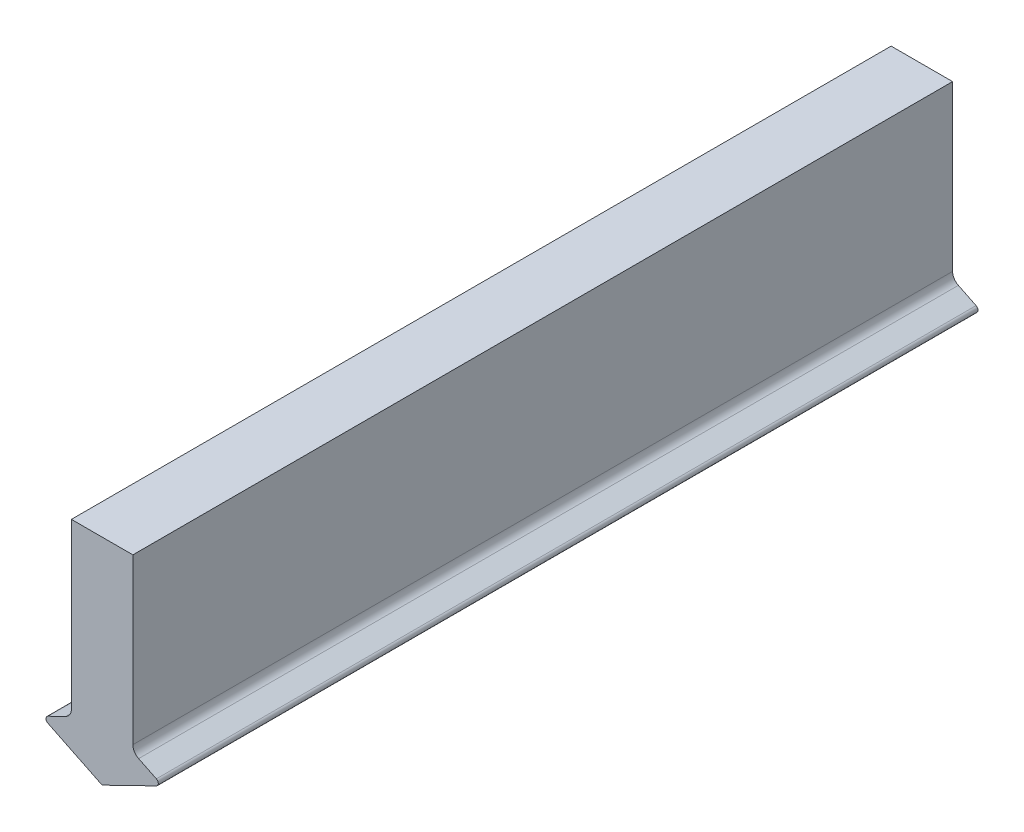
ISO-10303-21;
HEADER;
FILE_DESCRIPTION(('STEP AP214'),'2;1');
FILE_NAME('part.step','',(''),(''),'','','');
FILE_SCHEMA(('AUTOMOTIVE_DESIGN { 1 0 10303 214 1 1 1 1 }'));
ENDSEC;
DATA;
#1=APPLICATION_CONTEXT('core data for automotive mechanical design processes');
#2=APPLICATION_PROTOCOL_DEFINITION('international standard','automotive_design',2000,#1);
#3=PRODUCT_CONTEXT('',#1,'mechanical');
#4=PRODUCT('Part','Part','',(#3));
#5=PRODUCT_RELATED_PRODUCT_CATEGORY('part','',(#4));
#6=PRODUCT_DEFINITION_FORMATION('','',#4);
#7=PRODUCT_DEFINITION_CONTEXT('part definition',#1,'design');
#8=PRODUCT_DEFINITION('design','',#6,#7);
#9=PRODUCT_DEFINITION_SHAPE('','',#8);
#10=(LENGTH_UNIT() NAMED_UNIT(*) SI_UNIT(.MILLI.,.METRE.));
#11=(NAMED_UNIT(*) PLANE_ANGLE_UNIT() SI_UNIT($,.RADIAN.));
#12=(NAMED_UNIT(*) SI_UNIT($,.STERADIAN.) SOLID_ANGLE_UNIT());
#13=UNCERTAINTY_MEASURE_WITH_UNIT(LENGTH_MEASURE(1.E-05),#10,'distance_accuracy_value','');
#14=(GEOMETRIC_REPRESENTATION_CONTEXT(3) GLOBAL_UNCERTAINTY_ASSIGNED_CONTEXT((#13)) GLOBAL_UNIT_ASSIGNED_CONTEXT((#10,
#11,#12)) REPRESENTATION_CONTEXT('',''));
#15=CARTESIAN_POINT('',(0.,0.,0.));
#16=DIRECTION('',(0.,0.,1.));
#17=DIRECTION('',(1.,0.,0.));
#18=AXIS2_PLACEMENT_3D('',#15,#16,#17);
#19=CARTESIAN_POINT('',(3.17520498856519,1.54865094830014,48.));
#20=DIRECTION('',(-0.438371146789078,0.898794046299166,0.));
#21=DIRECTION('',(-0.898794046299167,-0.438371146789078,0.));
#22=AXIS2_PLACEMENT_3D('',#19,#20,#21);
#23=PLANE('',#22);
#24=DIRECTION('',(0.898794046299167,0.438371146789078,0.));
#25=VECTOR('',#24,1.);
#26=CARTESIAN_POINT('',(3.17520498856519,1.54865094830014,0.));
#27=LINE('',#26,#25);
#28=CARTESIAN_POINT('',(0.,0.,0.));
#29=VERTEX_POINT('',#28);
#30=CARTESIAN_POINT('',(3.17520498856519,1.54865094830014,0.));
#31=VERTEX_POINT('',#30);
#32=EDGE_CURVE('E151',#29,#31,#27,.T.);
#33=ORIENTED_EDGE('',*,*,#32,.T.);
#34=DIRECTION('',(0.,0.,-1.));
#35=VECTOR('',#34,1.);
#36=CARTESIAN_POINT('',(3.17520498856519,1.54865094830014,48.));
#37=LINE('',#36,#35);
#38=CARTESIAN_POINT('',(3.17520498856519,1.54865094830014,48.));
#39=VERTEX_POINT('',#38);
#40=EDGE_CURVE('E11',#39,#31,#37,.T.);
#41=ORIENTED_EDGE('',*,*,#40,.F.);
#42=DIRECTION('',(0.898794046299167,0.438371146789078,0.));
#43=VECTOR('',#42,1.);
#44=CARTESIAN_POINT('',(3.17520498856519,1.54865094830014,48.));
#45=LINE('',#44,#43);
#46=CARTESIAN_POINT('',(0.,0.,48.));
#47=VERTEX_POINT('',#46);
#48=EDGE_CURVE('E171',#47,#39,#45,.T.);
#49=ORIENTED_EDGE('',*,*,#48,.F.);
#50=DIRECTION('',(0.,0.,-1.));
#51=VECTOR('',#50,1.);
#52=CARTESIAN_POINT('',(0.,0.,48.));
#53=LINE('',#52,#51);
#54=EDGE_CURVE('E147',#47,#29,#53,.T.);
#55=ORIENTED_EDGE('',*,*,#54,.T.);
#56=EDGE_LOOP('',(#33,#41,#49,#55));
#57=FACE_BOUND('',#56,.T.);
#58=ADVANCED_FACE('F37',(#57),#23,.F.);
#59=CARTESIAN_POINT('',(3.08753075920738,1.72840975755998,48.));
#60=DIRECTION('',(0.,0.,-1.));
#61=DIRECTION('',(-1.,0.,0.));
#62=AXIS2_PLACEMENT_3D('',#59,#60,#61);
#63=CYLINDRICAL_SURFACE('',#62,0.2);
#64=CARTESIAN_POINT('',(3.08753075920738,1.72840975755998,0.));
#65=DIRECTION('',(0.,0.,1.));
#66=DIRECTION('',(1.,0.,0.));
#67=AXIS2_PLACEMENT_3D('',#64,#65,#66);
#68=CIRCLE('',#67,0.2);
#69=CARTESIAN_POINT('',(3.17520498856519,1.90816856681981,0.));
#70=VERTEX_POINT('',#69);
#71=EDGE_CURVE('E154',#31,#70,#68,.T.);
#72=ORIENTED_EDGE('',*,*,#71,.T.);
#73=DIRECTION('',(0.,0.,-1.));
#74=VECTOR('',#73,1.);
#75=CARTESIAN_POINT('',(3.17520498856519,1.90816856681981,48.));
#76=LINE('',#75,#74);
#77=CARTESIAN_POINT('',(3.17520498856519,1.90816856681981,48.));
#78=VERTEX_POINT('',#77);
#79=EDGE_CURVE('E45',#78,#70,#76,.T.);
#80=ORIENTED_EDGE('',*,*,#79,.F.);
#81=CARTESIAN_POINT('',(3.08753075920738,1.72840975755998,48.));
#82=DIRECTION('',(0.,0.,1.));
#83=DIRECTION('',(1.,0.,0.));
#84=AXIS2_PLACEMENT_3D('',#81,#82,#83);
#85=CIRCLE('',#84,0.2);
#86=EDGE_CURVE('E105',#39,#78,#85,.T.);
#87=ORIENTED_EDGE('',*,*,#86,.F.);
#88=ORIENTED_EDGE('',*,*,#40,.T.);
#89=EDGE_LOOP('',(#72,#80,#87,#88));
#90=FACE_BOUND('',#89,.T.);
#91=ADVANCED_FACE('F243',(#90),#63,.T.);
#92=CARTESIAN_POINT('',(2.13697686895111,2.41454625512105,48.));
#93=DIRECTION('',(-0.438371146789073,-0.898794046299169,0.));
#94=DIRECTION('',(0.898794046299169,-0.438371146789073,0.));
#95=AXIS2_PLACEMENT_3D('',#92,#93,#94);
#96=PLANE('',#95);
#97=DIRECTION('',(-0.898794046299169,0.438371146789073,0.));
#98=VECTOR('',#97,1.);
#99=CARTESIAN_POINT('',(2.13697686895111,2.41454625512105,0.));
#100=LINE('',#99,#98);
#101=CARTESIAN_POINT('',(2.13697686895111,2.41454625512105,0.));
#102=VERTEX_POINT('',#101);
#103=EDGE_CURVE('E156',#70,#102,#100,.T.);
#104=ORIENTED_EDGE('',*,*,#103,.T.);
#105=DIRECTION('',(0.,0.,-1.));
#106=VECTOR('',#105,1.);
#107=CARTESIAN_POINT('',(2.13697686895111,2.41454625512105,48.));
#108=LINE('',#107,#106);
#109=CARTESIAN_POINT('',(2.13697686895111,2.41454625512105,48.));
#110=VERTEX_POINT('',#109);
#111=EDGE_CURVE('E187',#110,#102,#108,.T.);
#112=ORIENTED_EDGE('',*,*,#111,.F.);
#113=DIRECTION('',(-0.898794046299169,0.438371146789073,0.));
#114=VECTOR('',#113,1.);
#115=CARTESIAN_POINT('',(2.13697686895111,2.41454625512105,48.));
#116=LINE('',#115,#114);
#117=EDGE_CURVE('E195',#78,#110,#116,.T.);
#118=ORIENTED_EDGE('',*,*,#117,.F.);
#119=ORIENTED_EDGE('',*,*,#79,.T.);
#120=EDGE_LOOP('',(#104,#112,#118,#119));
#121=FACE_BOUND('',#120,.T.);
#122=ADVANCED_FACE('F193',(#121),#96,.F.);
#123=CARTESIAN_POINT('',(2.39999955702455,2.95382268290055,48.));
#124=DIRECTION('',(0.,0.,-1.));
#125=DIRECTION('',(-1.,0.,0.));
#126=AXIS2_PLACEMENT_3D('',#123,#124,#125);
#127=CYLINDRICAL_SURFACE('',#126,0.6);
#128=CARTESIAN_POINT('',(2.39999955702455,2.95382268290055,0.));
#129=DIRECTION('',(0.,0.,-1.));
#130=DIRECTION('',(-1.,0.,0.));
#131=AXIS2_PLACEMENT_3D('',#128,#129,#130);
#132=CIRCLE('',#131,0.6);
#133=CARTESIAN_POINT('',(1.79999955702455,2.95382268290055,0.));
#134=VERTEX_POINT('',#133);
#135=EDGE_CURVE('E158',#102,#134,#132,.T.);
#136=ORIENTED_EDGE('',*,*,#135,.T.);
#137=DIRECTION('',(0.,0.,-1.));
#138=VECTOR('',#137,1.);
#139=CARTESIAN_POINT('',(1.79999955702455,2.95382268290055,48.));
#140=LINE('',#139,#138);
#141=CARTESIAN_POINT('',(1.79999955702455,2.95382268290055,48.));
#142=VERTEX_POINT('',#141);
#143=EDGE_CURVE('E184',#142,#134,#140,.T.);
#144=ORIENTED_EDGE('',*,*,#143,.F.);
#145=CARTESIAN_POINT('',(2.39999955702455,2.95382268290055,48.));
#146=DIRECTION('',(0.,0.,-1.));
#147=DIRECTION('',(-1.,0.,0.));
#148=AXIS2_PLACEMENT_3D('',#145,#146,#147);
#149=CIRCLE('',#148,0.6);
#150=EDGE_CURVE('E213',#110,#142,#149,.T.);
#151=ORIENTED_EDGE('',*,*,#150,.F.);
#152=ORIENTED_EDGE('',*,*,#111,.T.);
#153=EDGE_LOOP('',(#136,#144,#151,#152));
#154=FACE_BOUND('',#153,.T.);
#155=ADVANCED_FACE('F204',(#154),#127,.F.);
#156=CARTESIAN_POINT('',(1.79999955702455,12.578901071755,48.));
#157=DIRECTION('',(-1.,0.,0.));
#158=DIRECTION('',(0.,0.,1.));
#159=AXIS2_PLACEMENT_3D('',#156,#157,#158);
#160=PLANE('',#159);
#161=DIRECTION('',(0.,1.,0.));
#162=VECTOR('',#161,1.);
#163=CARTESIAN_POINT('',(1.79999955702455,12.578901071755,0.));
#164=LINE('',#163,#162);
#165=CARTESIAN_POINT('',(1.79999955702455,12.578901071755,0.));
#166=VERTEX_POINT('',#165);
#167=EDGE_CURVE('E160',#134,#166,#164,.T.);
#168=ORIENTED_EDGE('',*,*,#167,.T.);
#169=DIRECTION('',(0.,0.,-1.));
#170=VECTOR('',#169,1.);
#171=CARTESIAN_POINT('',(1.79999955702455,12.578901071755,48.));
#172=LINE('',#171,#170);
#173=CARTESIAN_POINT('',(1.79999955702455,12.578901071755,48.));
#174=VERTEX_POINT('',#173);
#175=EDGE_CURVE('E181',#174,#166,#172,.T.);
#176=ORIENTED_EDGE('',*,*,#175,.F.);
#177=DIRECTION('',(0.,1.,0.));
#178=VECTOR('',#177,1.);
#179=CARTESIAN_POINT('',(1.79999955702455,12.578901071755,48.));
#180=LINE('',#179,#178);
#181=EDGE_CURVE('E210',#142,#174,#180,.T.);
#182=ORIENTED_EDGE('',*,*,#181,.F.);
#183=ORIENTED_EDGE('',*,*,#143,.T.);
#184=EDGE_LOOP('',(#168,#176,#182,#183));
#185=FACE_BOUND('',#184,.T.);
#186=ADVANCED_FACE('F208',(#185),#160,.F.);
#187=CARTESIAN_POINT('',(-1.79999955702455,12.578901071755,48.));
#188=DIRECTION('',(0.,-1.,0.));
#189=DIRECTION('',(0.,0.,-1.));
#190=AXIS2_PLACEMENT_3D('',#187,#188,#189);
#191=PLANE('',#190);
#192=DIRECTION('',(-1.,0.,0.));
#193=VECTOR('',#192,1.);
#194=CARTESIAN_POINT('',(-1.79999955702455,12.578901071755,0.));
#195=LINE('',#194,#193);
#196=CARTESIAN_POINT('',(-1.79999955702455,12.578901071755,0.));
#197=VERTEX_POINT('',#196);
#198=EDGE_CURVE('E162',#166,#197,#195,.T.);
#199=ORIENTED_EDGE('',*,*,#198,.T.);
#200=DIRECTION('',(0.,0.,-1.));
#201=VECTOR('',#200,1.);
#202=CARTESIAN_POINT('',(-1.79999955702455,12.578901071755,48.));
#203=LINE('',#202,#201);
#204=CARTESIAN_POINT('',(-1.79999955702455,12.578901071755,48.));
#205=VERTEX_POINT('',#204);
#206=EDGE_CURVE('E178',#205,#197,#203,.T.);
#207=ORIENTED_EDGE('',*,*,#206,.F.);
#208=DIRECTION('',(-1.,0.,0.));
#209=VECTOR('',#208,1.);
#210=CARTESIAN_POINT('',(-1.79999955702455,12.578901071755,48.));
#211=LINE('',#210,#209);
#212=EDGE_CURVE('E212',#174,#205,#211,.T.);
#213=ORIENTED_EDGE('',*,*,#212,.F.);
#214=ORIENTED_EDGE('',*,*,#175,.T.);
#215=EDGE_LOOP('',(#199,#207,#213,#214));
#216=FACE_BOUND('',#215,.T.);
#217=ADVANCED_FACE('F256',(#216),#191,.F.);
#218=CARTESIAN_POINT('',(-1.79999955702455,2.95382268290055,48.));
#219=DIRECTION('',(1.,0.,0.));
#220=DIRECTION('',(0.,0.,-1.));
#221=AXIS2_PLACEMENT_3D('',#218,#219,#220);
#222=PLANE('',#221);
#223=DIRECTION('',(0.,-1.,0.));
#224=VECTOR('',#223,1.);
#225=CARTESIAN_POINT('',(-1.79999955702455,2.95382268290055,0.));
#226=LINE('',#225,#224);
#227=CARTESIAN_POINT('',(-1.79999955702455,2.95382268290055,0.));
#228=VERTEX_POINT('',#227);
#229=EDGE_CURVE('E164',#197,#228,#226,.T.);
#230=ORIENTED_EDGE('',*,*,#229,.T.);
#231=DIRECTION('',(0.,0.,-1.));
#232=VECTOR('',#231,1.);
#233=CARTESIAN_POINT('',(-1.79999955702455,2.95382268290055,48.));
#234=LINE('',#233,#232);
#235=CARTESIAN_POINT('',(-1.79999955702455,2.95382268290055,48.));
#236=VERTEX_POINT('',#235);
#237=EDGE_CURVE('E175',#236,#228,#234,.T.);
#238=ORIENTED_EDGE('',*,*,#237,.F.);
#239=DIRECTION('',(0.,-1.,0.));
#240=VECTOR('',#239,1.);
#241=CARTESIAN_POINT('',(-1.79999955702455,2.95382268290055,48.));
#242=LINE('',#241,#240);
#243=EDGE_CURVE('E215',#205,#236,#242,.T.);
#244=ORIENTED_EDGE('',*,*,#243,.F.);
#245=ORIENTED_EDGE('',*,*,#206,.T.);
#246=EDGE_LOOP('',(#230,#238,#244,#245));
#247=FACE_BOUND('',#246,.T.);
#248=ADVANCED_FACE('F224',(#247),#222,.F.);
#249=CARTESIAN_POINT('',(-2.39999955702455,2.95382268290055,48.));
#250=DIRECTION('',(0.,0.,-1.));
#251=DIRECTION('',(-1.,0.,0.));
#252=AXIS2_PLACEMENT_3D('',#249,#250,#251);
#253=CYLINDRICAL_SURFACE('',#252,0.6);
#254=CARTESIAN_POINT('',(-2.39999955702455,2.95382268290055,0.));
#255=DIRECTION('',(0.,0.,-1.));
#256=DIRECTION('',(1.,0.,0.));
#257=AXIS2_PLACEMENT_3D('',#254,#255,#256);
#258=CIRCLE('',#257,0.6);
#259=CARTESIAN_POINT('',(-2.13697686895111,2.41454625512105,0.));
#260=VERTEX_POINT('',#259);
#261=EDGE_CURVE('E166',#228,#260,#258,.T.);
#262=ORIENTED_EDGE('',*,*,#261,.T.);
#263=DIRECTION('',(0.,0.,-1.));
#264=VECTOR('',#263,1.);
#265=CARTESIAN_POINT('',(-2.13697686895111,2.41454625512105,48.));
#266=LINE('',#265,#264);
#267=CARTESIAN_POINT('',(-2.13697686895111,2.41454625512105,48.));
#268=VERTEX_POINT('',#267);
#269=EDGE_CURVE('E142',#268,#260,#266,.T.);
#270=ORIENTED_EDGE('',*,*,#269,.F.);
#271=CARTESIAN_POINT('',(-2.39999955702455,2.95382268290055,48.));
#272=DIRECTION('',(0.,0.,-1.));
#273=DIRECTION('',(1.,0.,0.));
#274=AXIS2_PLACEMENT_3D('',#271,#272,#273);
#275=CIRCLE('',#274,0.6);
#276=EDGE_CURVE('E133',#236,#268,#275,.T.);
#277=ORIENTED_EDGE('',*,*,#276,.F.);
#278=ORIENTED_EDGE('',*,*,#237,.T.);
#279=EDGE_LOOP('',(#262,#270,#277,#278));
#280=FACE_BOUND('',#279,.T.);
#281=ADVANCED_FACE('F228',(#280),#253,.F.);
#282=CARTESIAN_POINT('',(-3.17520498856519,1.90816856681981,48.));
#283=DIRECTION('',(0.438371146789073,-0.898794046299169,0.));
#284=DIRECTION('',(0.898794046299169,0.438371146789073,0.));
#285=AXIS2_PLACEMENT_3D('',#282,#283,#284);
#286=PLANE('',#285);
#287=DIRECTION('',(-0.898794046299169,-0.438371146789073,0.));
#288=VECTOR('',#287,1.);
#289=CARTESIAN_POINT('',(-3.17520498856519,1.90816856681981,0.));
#290=LINE('',#289,#288);
#291=CARTESIAN_POINT('',(-3.17520498856519,1.90816856681981,0.));
#292=VERTEX_POINT('',#291);
#293=EDGE_CURVE('E141',#260,#292,#290,.T.);
#294=ORIENTED_EDGE('',*,*,#293,.T.);
#295=DIRECTION('',(0.,0.,-1.));
#296=VECTOR('',#295,1.);
#297=CARTESIAN_POINT('',(-3.17520498856519,1.90816856681981,48.));
#298=LINE('',#297,#296);
#299=CARTESIAN_POINT('',(-3.17520498856519,1.90816856681981,48.));
#300=VERTEX_POINT('',#299);
#301=EDGE_CURVE('E138',#300,#292,#298,.T.);
#302=ORIENTED_EDGE('',*,*,#301,.F.);
#303=DIRECTION('',(-0.898794046299169,-0.438371146789073,0.));
#304=VECTOR('',#303,1.);
#305=CARTESIAN_POINT('',(-3.17520498856519,1.90816856681981,48.));
#306=LINE('',#305,#304);
#307=EDGE_CURVE('E127',#268,#300,#306,.T.);
#308=ORIENTED_EDGE('',*,*,#307,.F.);
#309=ORIENTED_EDGE('',*,*,#269,.T.);
#310=EDGE_LOOP('',(#294,#302,#308,#309));
#311=FACE_BOUND('',#310,.T.);
#312=ADVANCED_FACE('F139',(#311),#286,.F.);
#313=CARTESIAN_POINT('',(-3.08753075920738,1.72840975755998,48.));
#314=DIRECTION('',(0.,0.,-1.));
#315=DIRECTION('',(-1.,0.,0.));
#316=AXIS2_PLACEMENT_3D('',#313,#314,#315);
#317=CYLINDRICAL_SURFACE('',#316,0.2);
#318=CARTESIAN_POINT('',(-3.08753075920738,1.72840975755998,0.));
#319=DIRECTION('',(0.,0.,1.));
#320=DIRECTION('',(1.,0.,0.));
#321=AXIS2_PLACEMENT_3D('',#318,#319,#320);
#322=CIRCLE('',#321,0.2);
#323=CARTESIAN_POINT('',(-3.17520498856519,1.54865094830014,0.));
#324=VERTEX_POINT('',#323);
#325=EDGE_CURVE('E91',#292,#324,#322,.T.);
#326=ORIENTED_EDGE('',*,*,#325,.T.);
#327=DIRECTION('',(0.,0.,-1.));
#328=VECTOR('',#327,1.);
#329=CARTESIAN_POINT('',(-3.17520498856519,1.54865094830014,48.));
#330=LINE('',#329,#328);
#331=CARTESIAN_POINT('',(-3.17520498856519,1.54865094830014,48.));
#332=VERTEX_POINT('',#331);
#333=EDGE_CURVE('E143',#332,#324,#330,.T.);
#334=ORIENTED_EDGE('',*,*,#333,.F.);
#335=CARTESIAN_POINT('',(-3.08753075920738,1.72840975755998,48.));
#336=DIRECTION('',(0.,0.,1.));
#337=DIRECTION('',(1.,0.,0.));
#338=AXIS2_PLACEMENT_3D('',#335,#336,#337);
#339=CIRCLE('',#338,0.2);
#340=EDGE_CURVE('E131',#300,#332,#339,.T.);
#341=ORIENTED_EDGE('',*,*,#340,.F.);
#342=ORIENTED_EDGE('',*,*,#301,.T.);
#343=EDGE_LOOP('',(#326,#334,#341,#342));
#344=FACE_BOUND('',#343,.T.);
#345=ADVANCED_FACE('F145',(#344),#317,.T.);
#346=CARTESIAN_POINT('',(0.,0.,48.));
#347=DIRECTION('',(0.438371146789078,0.898794046299166,0.));
#348=DIRECTION('',(-0.898794046299167,0.438371146789078,0.));
#349=AXIS2_PLACEMENT_3D('',#346,#347,#348);
#350=PLANE('',#349);
#351=DIRECTION('',(0.898794046299167,-0.438371146789078,0.));
#352=VECTOR('',#351,1.);
#353=CARTESIAN_POINT('',(0.,0.,0.));
#354=LINE('',#353,#352);
#355=EDGE_CURVE('E97',#324,#29,#354,.T.);
#356=ORIENTED_EDGE('',*,*,#355,.T.);
#357=ORIENTED_EDGE('',*,*,#54,.F.);
#358=DIRECTION('',(0.898794046299167,-0.438371146789078,0.));
#359=VECTOR('',#358,1.);
#360=CARTESIAN_POINT('',(0.,0.,48.));
#361=LINE('',#360,#359);
#362=EDGE_CURVE('E53',#332,#47,#361,.T.);
#363=ORIENTED_EDGE('',*,*,#362,.F.);
#364=ORIENTED_EDGE('',*,*,#333,.T.);
#365=EDGE_LOOP('',(#356,#357,#363,#364));
#366=FACE_BOUND('',#365,.T.);
#367=ADVANCED_FACE('F232',(#366),#350,.F.);
#368=CARTESIAN_POINT('',(-3.08753075920738,1.72840975755998,48.));
#369=DIRECTION('',(0.,0.,1.));
#370=DIRECTION('',(1.,0.,0.));
#371=AXIS2_PLACEMENT_3D('',#368,#369,#370);
#372=PLANE('',#371);
#373=ORIENTED_EDGE('',*,*,#48,.T.);
#374=ORIENTED_EDGE('',*,*,#86,.T.);
#375=ORIENTED_EDGE('',*,*,#117,.T.);
#376=ORIENTED_EDGE('',*,*,#150,.T.);
#377=ORIENTED_EDGE('',*,*,#181,.T.);
#378=ORIENTED_EDGE('',*,*,#212,.T.);
#379=ORIENTED_EDGE('',*,*,#243,.T.);
#380=ORIENTED_EDGE('',*,*,#276,.T.);
#381=ORIENTED_EDGE('',*,*,#307,.T.);
#382=ORIENTED_EDGE('',*,*,#340,.T.);
#383=ORIENTED_EDGE('',*,*,#362,.T.);
#384=EDGE_LOOP('',(#373,#374,#375,#376,#377,#378,#379,#380,#381,#382,#383));
#385=FACE_BOUND('',#384,.T.);
#386=ADVANCED_FACE('F129',(#385),#372,.T.);
#387=CARTESIAN_POINT('',(-3.08753075920738,1.72840975755998,0.));
#388=DIRECTION('',(0.,0.,1.));
#389=DIRECTION('',(1.,0.,0.));
#390=AXIS2_PLACEMENT_3D('',#387,#388,#389);
#391=PLANE('',#390);
#392=ORIENTED_EDGE('',*,*,#32,.F.);
#393=ORIENTED_EDGE('',*,*,#355,.F.);
#394=ORIENTED_EDGE('',*,*,#325,.F.);
#395=ORIENTED_EDGE('',*,*,#293,.F.);
#396=ORIENTED_EDGE('',*,*,#261,.F.);
#397=ORIENTED_EDGE('',*,*,#229,.F.);
#398=ORIENTED_EDGE('',*,*,#198,.F.);
#399=ORIENTED_EDGE('',*,*,#167,.F.);
#400=ORIENTED_EDGE('',*,*,#135,.F.);
#401=ORIENTED_EDGE('',*,*,#103,.F.);
#402=ORIENTED_EDGE('',*,*,#71,.F.);
#403=EDGE_LOOP('',(#392,#393,#394,#395,#396,#397,#398,#399,#400,#401,#402));
#404=FACE_BOUND('',#403,.T.);
#405=ADVANCED_FACE('F199',(#404),#391,.F.);
#406=CLOSED_SHELL('',(#58,#91,#122,#155,#186,#217,#248,#281,#312,#345,#367,#386,#405));
#407=MANIFOLD_SOLID_BREP('B2',#406);
#408=ADVANCED_BREP_SHAPE_REPRESENTATION('',(#18,#407),#14);
#409=SHAPE_DEFINITION_REPRESENTATION(#9,#408);
ENDSEC;
END-ISO-10303-21;
